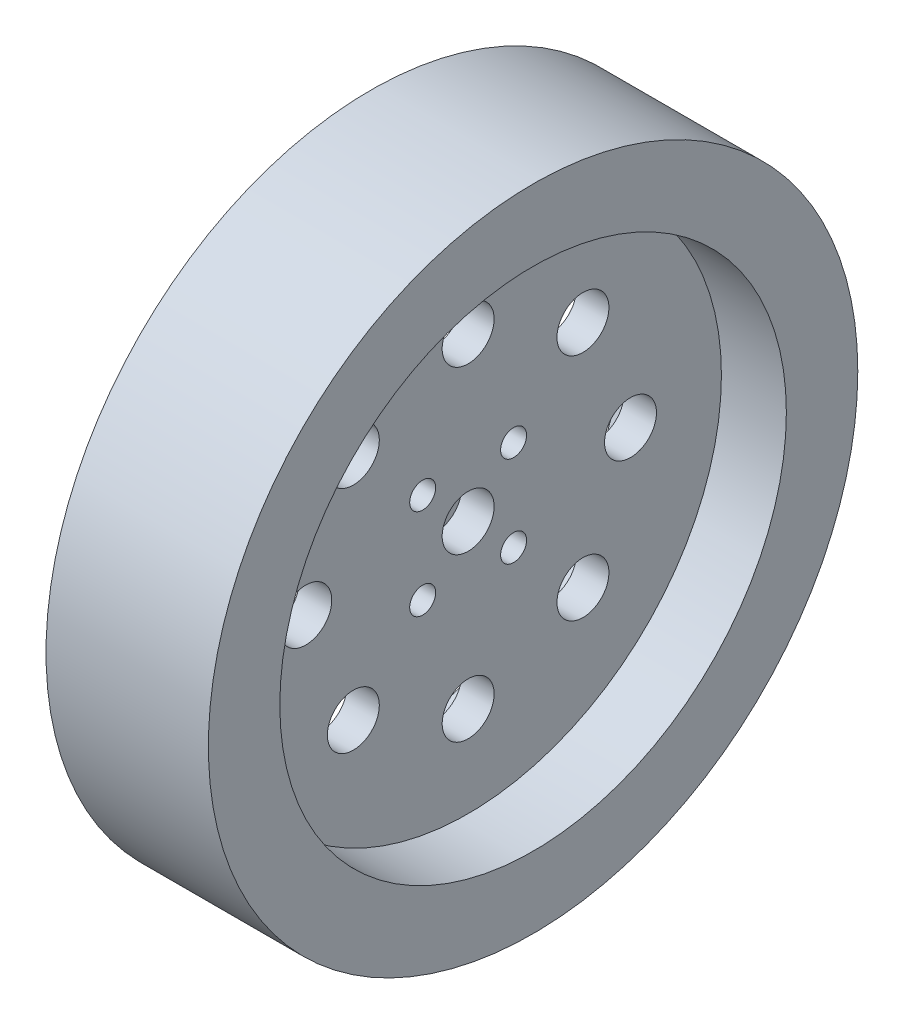
ISO-10303-21;
HEADER;
FILE_DESCRIPTION(('STEP AP214'),'2;1');
FILE_NAME('part.step','',(''),(''),'','','');
FILE_SCHEMA(('AUTOMOTIVE_DESIGN { 1 0 10303 214 1 1 1 1 }'));
ENDSEC;
DATA;
#1=APPLICATION_CONTEXT('core data for automotive mechanical design processes');
#2=APPLICATION_PROTOCOL_DEFINITION('international standard','automotive_design',2000,#1);
#3=PRODUCT_CONTEXT('',#1,'mechanical');
#4=PRODUCT('Part','Part','',(#3));
#5=PRODUCT_RELATED_PRODUCT_CATEGORY('part','',(#4));
#6=PRODUCT_DEFINITION_FORMATION('','',#4);
#7=PRODUCT_DEFINITION_CONTEXT('part definition',#1,'design');
#8=PRODUCT_DEFINITION('design','',#6,#7);
#9=PRODUCT_DEFINITION_SHAPE('','',#8);
#10=(LENGTH_UNIT() NAMED_UNIT(*) SI_UNIT(.MILLI.,.METRE.));
#11=(NAMED_UNIT(*) PLANE_ANGLE_UNIT() SI_UNIT($,.RADIAN.));
#12=(NAMED_UNIT(*) SI_UNIT($,.STERADIAN.) SOLID_ANGLE_UNIT());
#13=UNCERTAINTY_MEASURE_WITH_UNIT(LENGTH_MEASURE(1.E-05),#10,'distance_accuracy_value','');
#14=(GEOMETRIC_REPRESENTATION_CONTEXT(3) GLOBAL_UNCERTAINTY_ASSIGNED_CONTEXT((#13)) GLOBAL_UNIT_ASSIGNED_CONTEXT((#10,
#11,#12)) REPRESENTATION_CONTEXT('',''));
#15=CARTESIAN_POINT('',(0.,0.,0.));
#16=DIRECTION('',(0.,0.,1.));
#17=DIRECTION('',(1.,0.,0.));
#18=AXIS2_PLACEMENT_3D('',#15,#16,#17);
#19=CARTESIAN_POINT('',(12.5,0.,0.));
#20=DIRECTION('',(-1.,0.,0.));
#21=DIRECTION('',(0.,0.,1.));
#22=AXIS2_PLACEMENT_3D('',#19,#20,#21);
#23=CYLINDRICAL_SURFACE('',#22,50.);
#24=CARTESIAN_POINT('',(12.5,0.,0.));
#25=DIRECTION('',(1.,0.,0.));
#26=DIRECTION('',(0.,0.,-1.));
#27=AXIS2_PLACEMENT_3D('',#24,#25,#26);
#28=CIRCLE('',#27,50.);
#29=CARTESIAN_POINT('',(12.5,0.,-50.));
#30=VERTEX_POINT('',#29);
#31=EDGE_CURVE('E10',#30,#30,#28,.T.);
#32=ORIENTED_EDGE('',*,*,#31,.F.);
#33=EDGE_LOOP('',(#32));
#34=FACE_BOUND('',#33,.T.);
#35=CARTESIAN_POINT('',(-12.5,0.,0.));
#36=DIRECTION('',(1.,0.,0.));
#37=DIRECTION('',(0.,0.,-1.));
#38=AXIS2_PLACEMENT_3D('',#35,#36,#37);
#39=CIRCLE('',#38,50.);
#40=CARTESIAN_POINT('',(-12.5,0.,-50.));
#41=VERTEX_POINT('',#40);
#42=EDGE_CURVE('E83',#41,#41,#39,.T.);
#43=ORIENTED_EDGE('',*,*,#42,.T.);
#44=EDGE_LOOP('',(#43));
#45=FACE_BOUND('',#44,.T.);
#46=ADVANCED_FACE('F30',(#34,#45),#23,.T.);
#47=CARTESIAN_POINT('',(12.5,0.,0.));
#48=DIRECTION('',(1.,0.,0.));
#49=DIRECTION('',(0.,0.,-1.));
#50=AXIS2_PLACEMENT_3D('',#47,#48,#49);
#51=PLANE('',#50);
#52=CARTESIAN_POINT('',(12.5,0.,0.));
#53=DIRECTION('',(1.,0.,0.));
#54=DIRECTION('',(0.,0.,-1.));
#55=AXIS2_PLACEMENT_3D('',#52,#53,#54);
#56=CIRCLE('',#55,39.);
#57=CARTESIAN_POINT('',(12.5,0.,-39.));
#58=VERTEX_POINT('',#57);
#59=EDGE_CURVE('E40',#58,#58,#56,.T.);
#60=ORIENTED_EDGE('',*,*,#59,.F.);
#61=EDGE_LOOP('',(#60));
#62=FACE_BOUND('',#61,.T.);
#63=ORIENTED_EDGE('',*,*,#31,.T.);
#64=EDGE_LOOP('',(#63));
#65=FACE_BOUND('',#64,.T.);
#66=ADVANCED_FACE('F185',(#62,#65),#51,.T.);
#67=CARTESIAN_POINT('',(2.5,0.,0.));
#68=DIRECTION('',(1.,0.,0.));
#69=DIRECTION('',(0.,0.,-1.));
#70=AXIS2_PLACEMENT_3D('',#67,#68,#69);
#71=CYLINDRICAL_SURFACE('',#70,39.);
#72=CARTESIAN_POINT('',(2.5,0.,0.));
#73=DIRECTION('',(1.,0.,0.));
#74=DIRECTION('',(0.,0.,-1.));
#75=AXIS2_PLACEMENT_3D('',#72,#73,#74);
#76=CIRCLE('',#75,39.);
#77=CARTESIAN_POINT('',(2.5,0.,-39.));
#78=VERTEX_POINT('',#77);
#79=EDGE_CURVE('E36',#78,#78,#76,.T.);
#80=ORIENTED_EDGE('',*,*,#79,.F.);
#81=EDGE_LOOP('',(#80));
#82=FACE_BOUND('',#81,.T.);
#83=ORIENTED_EDGE('',*,*,#59,.T.);
#84=EDGE_LOOP('',(#83));
#85=FACE_BOUND('',#84,.T.);
#86=ADVANCED_FACE('F190',(#82,#85),#71,.F.);
#87=CARTESIAN_POINT('',(2.5,0.,0.));
#88=DIRECTION('',(1.,0.,0.));
#89=DIRECTION('',(0.,0.,-1.));
#90=AXIS2_PLACEMENT_3D('',#87,#88,#89);
#91=PLANE('',#90);
#92=CARTESIAN_POINT('',(2.5,-7.,-7.));
#93=DIRECTION('',(1.,0.,0.));
#94=DIRECTION('',(0.,0.,1.));
#95=AXIS2_PLACEMENT_3D('',#92,#93,#94);
#96=CIRCLE('',#95,2.);
#97=CARTESIAN_POINT('',(2.5,-7.,-5.));
#98=VERTEX_POINT('',#97);
#99=EDGE_CURVE('E79',#98,#98,#96,.T.);
#100=ORIENTED_EDGE('',*,*,#99,.F.);
#101=EDGE_LOOP('',(#100));
#102=FACE_BOUND('',#101,.T.);
#103=CARTESIAN_POINT('',(2.5,7.00000000000007,-6.99999999999993));
#104=DIRECTION('',(1.,0.,0.));
#105=DIRECTION('',(0.,-1.,0.));
#106=AXIS2_PLACEMENT_3D('',#103,#104,#105);
#107=CIRCLE('',#106,2.);
#108=CARTESIAN_POINT('',(2.5,5.00000000000007,-6.99999999999995));
#109=VERTEX_POINT('',#108);
#110=EDGE_CURVE('E80',#109,#109,#107,.T.);
#111=ORIENTED_EDGE('',*,*,#110,.F.);
#112=EDGE_LOOP('',(#111));
#113=FACE_BOUND('',#112,.T.);
#114=CARTESIAN_POINT('',(2.5,-7.00000000000002,6.99999999999998));
#115=DIRECTION('',(1.,0.,0.));
#116=DIRECTION('',(0.,1.,0.));
#117=AXIS2_PLACEMENT_3D('',#114,#115,#116);
#118=CIRCLE('',#117,2.);
#119=CARTESIAN_POINT('',(2.5,-5.00000000000002,6.99999999999998));
#120=VERTEX_POINT('',#119);
#121=EDGE_CURVE('E76',#120,#120,#118,.T.);
#122=ORIENTED_EDGE('',*,*,#121,.F.);
#123=EDGE_LOOP('',(#122));
#124=FACE_BOUND('',#123,.T.);
#125=CARTESIAN_POINT('',(2.5,7.,7.));
#126=DIRECTION('',(1.,0.,0.));
#127=DIRECTION('',(0.,0.,-1.));
#128=AXIS2_PLACEMENT_3D('',#125,#126,#127);
#129=CIRCLE('',#128,2.);
#130=CARTESIAN_POINT('',(2.5,7.,5.));
#131=VERTEX_POINT('',#130);
#132=EDGE_CURVE('E73',#131,#131,#129,.T.);
#133=ORIENTED_EDGE('',*,*,#132,.F.);
#134=EDGE_LOOP('',(#133));
#135=FACE_BOUND('',#134,.T.);
#136=CARTESIAN_POINT('',(2.5,0.,0.));
#137=DIRECTION('',(1.,0.,0.));
#138=DIRECTION('',(0.,0.,-1.));
#139=AXIS2_PLACEMENT_3D('',#136,#137,#138);
#140=CIRCLE('',#139,4.);
#141=CARTESIAN_POINT('',(2.5,0.,-4.));
#142=VERTEX_POINT('',#141);
#143=EDGE_CURVE('E57',#142,#142,#140,.T.);
#144=ORIENTED_EDGE('',*,*,#143,.F.);
#145=EDGE_LOOP('',(#144));
#146=FACE_BOUND('',#145,.T.);
#147=CARTESIAN_POINT('',(2.5,0.,25.));
#148=DIRECTION('',(1.,0.,0.));
#149=DIRECTION('',(0.,1.,0.));
#150=AXIS2_PLACEMENT_3D('',#147,#148,#149);
#151=CIRCLE('',#150,4.);
#152=CARTESIAN_POINT('',(2.5,3.99999999999991,25.));
#153=VERTEX_POINT('',#152);
#154=EDGE_CURVE('E52',#153,#153,#151,.T.);
#155=ORIENTED_EDGE('',*,*,#154,.F.);
#156=EDGE_LOOP('',(#155));
#157=FACE_BOUND('',#156,.T.);
#158=CARTESIAN_POINT('',(2.5,-17.6776695296638,17.6776695296636));
#159=DIRECTION('',(1.,0.,0.));
#160=DIRECTION('',(0.,0.707106781186544,0.707106781186551));
#161=AXIS2_PLACEMENT_3D('',#158,#159,#160);
#162=CIRCLE('',#161,4.);
#163=CARTESIAN_POINT('',(2.5,-14.8492424049176,20.5060966544098));
#164=VERTEX_POINT('',#163);
#165=EDGE_CURVE('E66',#164,#164,#162,.T.);
#166=ORIENTED_EDGE('',*,*,#165,.F.);
#167=EDGE_LOOP('',(#166));
#168=FACE_BOUND('',#167,.T.);
#169=CARTESIAN_POINT('',(2.5,-25.,0.));
#170=DIRECTION('',(1.,0.,0.));
#171=DIRECTION('',(0.,0.,1.));
#172=AXIS2_PLACEMENT_3D('',#169,#170,#171);
#173=CIRCLE('',#172,4.);
#174=CARTESIAN_POINT('',(2.5,-25.,4.));
#175=VERTEX_POINT('',#174);
#176=EDGE_CURVE('E63',#175,#175,#173,.T.);
#177=ORIENTED_EDGE('',*,*,#176,.F.);
#178=EDGE_LOOP('',(#177));
#179=FACE_BOUND('',#178,.T.);
#180=CARTESIAN_POINT('',(2.5,-17.6776695296635,-17.6776695296638));
#181=DIRECTION('',(1.,0.,0.));
#182=DIRECTION('',(0.,-0.707106781186554,0.707106781186541));
#183=AXIS2_PLACEMENT_3D('',#180,#181,#182);
#184=CIRCLE('',#183,4.);
#185=CARTESIAN_POINT('',(2.5,-20.5060966544097,-14.8492424049177));
#186=VERTEX_POINT('',#185);
#187=EDGE_CURVE('E60',#186,#186,#184,.T.);
#188=ORIENTED_EDGE('',*,*,#187,.F.);
#189=EDGE_LOOP('',(#188));
#190=FACE_BOUND('',#189,.T.);
#191=CARTESIAN_POINT('',(2.5,2.61861100413235E-13,-25.));
#192=DIRECTION('',(1.,0.,0.));
#193=DIRECTION('',(0.,-1.,0.));
#194=AXIS2_PLACEMENT_3D('',#191,#192,#193);
#195=CIRCLE('',#194,4.);
#196=CARTESIAN_POINT('',(2.5,-3.99999999999974,-25.));
#197=VERTEX_POINT('',#196);
#198=EDGE_CURVE('E56',#197,#197,#195,.T.);
#199=ORIENTED_EDGE('',*,*,#198,.F.);
#200=EDGE_LOOP('',(#199));
#201=FACE_BOUND('',#200,.T.);
#202=CARTESIAN_POINT('',(2.5,17.6776695296639,-17.6776695296635));
#203=DIRECTION('',(1.,0.,0.));
#204=DIRECTION('',(0.,-0.707106781186539,-0.707106781186556));
#205=AXIS2_PLACEMENT_3D('',#202,#203,#204);
#206=CIRCLE('',#205,4.);
#207=CARTESIAN_POINT('',(2.5,14.8492424049177,-20.5060966544097));
#208=VERTEX_POINT('',#207);
#209=EDGE_CURVE('E53',#208,#208,#206,.T.);
#210=ORIENTED_EDGE('',*,*,#209,.F.);
#211=EDGE_LOOP('',(#210));
#212=FACE_BOUND('',#211,.T.);
#213=CARTESIAN_POINT('',(2.5,17.6776695296637,17.6776695296637));
#214=DIRECTION('',(1.,0.,0.));
#215=DIRECTION('',(0.,0.707106781186549,-0.707106781186546));
#216=AXIS2_PLACEMENT_3D('',#213,#214,#215);
#217=CIRCLE('',#216,4.);
#218=CARTESIAN_POINT('',(2.5,20.5060966544099,14.8492424049175));
#219=VERTEX_POINT('',#218);
#220=EDGE_CURVE('E49',#219,#219,#217,.T.);
#221=ORIENTED_EDGE('',*,*,#220,.F.);
#222=EDGE_LOOP('',(#221));
#223=FACE_BOUND('',#222,.T.);
#224=CARTESIAN_POINT('',(2.5,25.,0.));
#225=DIRECTION('',(1.,0.,0.));
#226=DIRECTION('',(0.,0.,-1.));
#227=AXIS2_PLACEMENT_3D('',#224,#225,#226);
#228=CIRCLE('',#227,4.);
#229=CARTESIAN_POINT('',(2.5,25.,-4.));
#230=VERTEX_POINT('',#229);
#231=EDGE_CURVE('E45',#230,#230,#228,.T.);
#232=ORIENTED_EDGE('',*,*,#231,.F.);
#233=EDGE_LOOP('',(#232));
#234=FACE_BOUND('',#233,.T.);
#235=ORIENTED_EDGE('',*,*,#79,.T.);
#236=EDGE_LOOP('',(#235));
#237=FACE_BOUND('',#236,.T.);
#238=ADVANCED_FACE('F195',(#102,#113,#124,#135,#146,#157,#168,#179,#190,#201,#212,#223,#234,
#237),#91,.T.);
#239=CARTESIAN_POINT('',(0.,25.,0.));
#240=DIRECTION('',(1.,0.,0.));
#241=DIRECTION('',(0.,0.,-1.));
#242=AXIS2_PLACEMENT_3D('',#239,#240,#241);
#243=CYLINDRICAL_SURFACE('',#242,4.);
#244=ORIENTED_EDGE('',*,*,#231,.T.);
#245=EDGE_LOOP('',(#244));
#246=FACE_BOUND('',#245,.T.);
#247=CARTESIAN_POINT('',(-2.5,25.,0.));
#248=DIRECTION('',(1.,0.,0.));
#249=DIRECTION('',(0.,0.,-1.));
#250=AXIS2_PLACEMENT_3D('',#247,#248,#249);
#251=CIRCLE('',#250,4.);
#252=CARTESIAN_POINT('',(-2.5,25.,-4.));
#253=VERTEX_POINT('',#252);
#254=EDGE_CURVE('E92',#253,#253,#251,.T.);
#255=ORIENTED_EDGE('',*,*,#254,.F.);
#256=EDGE_LOOP('',(#255));
#257=FACE_BOUND('',#256,.T.);
#258=ADVANCED_FACE('F202',(#246,#257),#243,.F.);
#259=CARTESIAN_POINT('',(0.,17.6776695296637,17.6776695296637));
#260=DIRECTION('',(1.,0.,0.));
#261=DIRECTION('',(0.,0.,-1.));
#262=AXIS2_PLACEMENT_3D('',#259,#260,#261);
#263=CYLINDRICAL_SURFACE('',#262,4.);
#264=ORIENTED_EDGE('',*,*,#220,.T.);
#265=EDGE_LOOP('',(#264));
#266=FACE_BOUND('',#265,.T.);
#267=CARTESIAN_POINT('',(-2.5,17.6776695296637,17.6776695296637));
#268=DIRECTION('',(1.,0.,0.));
#269=DIRECTION('',(0.,0.707106781186549,-0.707106781186546));
#270=AXIS2_PLACEMENT_3D('',#267,#268,#269);
#271=CIRCLE('',#270,4.);
#272=CARTESIAN_POINT('',(-2.5,20.5060966544099,14.8492424049175));
#273=VERTEX_POINT('',#272);
#274=EDGE_CURVE('E97',#273,#273,#271,.T.);
#275=ORIENTED_EDGE('',*,*,#274,.F.);
#276=EDGE_LOOP('',(#275));
#277=FACE_BOUND('',#276,.T.);
#278=ADVANCED_FACE('F206',(#266,#277),#263,.F.);
#279=CARTESIAN_POINT('',(0.,17.6776695296639,-17.6776695296635));
#280=DIRECTION('',(1.,0.,0.));
#281=DIRECTION('',(0.,0.,-1.));
#282=AXIS2_PLACEMENT_3D('',#279,#280,#281);
#283=CYLINDRICAL_SURFACE('',#282,4.);
#284=ORIENTED_EDGE('',*,*,#209,.T.);
#285=EDGE_LOOP('',(#284));
#286=FACE_BOUND('',#285,.T.);
#287=CARTESIAN_POINT('',(-2.5,17.6776695296639,-17.6776695296635));
#288=DIRECTION('',(1.,0.,0.));
#289=DIRECTION('',(0.,-0.707106781186539,-0.707106781186556));
#290=AXIS2_PLACEMENT_3D('',#287,#288,#289);
#291=CIRCLE('',#290,4.);
#292=CARTESIAN_POINT('',(-2.5,14.8492424049177,-20.5060966544097));
#293=VERTEX_POINT('',#292);
#294=EDGE_CURVE('E98',#293,#293,#291,.T.);
#295=ORIENTED_EDGE('',*,*,#294,.F.);
#296=EDGE_LOOP('',(#295));
#297=FACE_BOUND('',#296,.T.);
#298=ADVANCED_FACE('F210',(#286,#297),#283,.F.);
#299=CARTESIAN_POINT('',(0.,2.61861100413235E-13,-25.));
#300=DIRECTION('',(1.,0.,0.));
#301=DIRECTION('',(0.,0.,-1.));
#302=AXIS2_PLACEMENT_3D('',#299,#300,#301);
#303=CYLINDRICAL_SURFACE('',#302,4.);
#304=ORIENTED_EDGE('',*,*,#198,.T.);
#305=EDGE_LOOP('',(#304));
#306=FACE_BOUND('',#305,.T.);
#307=CARTESIAN_POINT('',(-2.5,2.61861100413235E-13,-25.));
#308=DIRECTION('',(1.,0.,0.));
#309=DIRECTION('',(0.,-1.,0.));
#310=AXIS2_PLACEMENT_3D('',#307,#308,#309);
#311=CIRCLE('',#310,4.);
#312=CARTESIAN_POINT('',(-2.5,-3.99999999999974,-25.));
#313=VERTEX_POINT('',#312);
#314=EDGE_CURVE('E101',#313,#313,#311,.T.);
#315=ORIENTED_EDGE('',*,*,#314,.F.);
#316=EDGE_LOOP('',(#315));
#317=FACE_BOUND('',#316,.T.);
#318=ADVANCED_FACE('F214',(#306,#317),#303,.F.);
#319=CARTESIAN_POINT('',(0.,-17.6776695296635,-17.6776695296638));
#320=DIRECTION('',(1.,0.,0.));
#321=DIRECTION('',(0.,0.,-1.));
#322=AXIS2_PLACEMENT_3D('',#319,#320,#321);
#323=CYLINDRICAL_SURFACE('',#322,4.);
#324=ORIENTED_EDGE('',*,*,#187,.T.);
#325=EDGE_LOOP('',(#324));
#326=FACE_BOUND('',#325,.T.);
#327=CARTESIAN_POINT('',(-2.5,-17.6776695296635,-17.6776695296638));
#328=DIRECTION('',(1.,0.,0.));
#329=DIRECTION('',(0.,-0.707106781186554,0.707106781186541));
#330=AXIS2_PLACEMENT_3D('',#327,#328,#329);
#331=CIRCLE('',#330,4.);
#332=CARTESIAN_POINT('',(-2.5,-20.5060966544097,-14.8492424049177));
#333=VERTEX_POINT('',#332);
#334=EDGE_CURVE('E105',#333,#333,#331,.T.);
#335=ORIENTED_EDGE('',*,*,#334,.F.);
#336=EDGE_LOOP('',(#335));
#337=FACE_BOUND('',#336,.T.);
#338=ADVANCED_FACE('F218',(#326,#337),#323,.F.);
#339=CARTESIAN_POINT('',(0.,-25.,0.));
#340=DIRECTION('',(1.,0.,0.));
#341=DIRECTION('',(0.,0.,-1.));
#342=AXIS2_PLACEMENT_3D('',#339,#340,#341);
#343=CYLINDRICAL_SURFACE('',#342,4.);
#344=ORIENTED_EDGE('',*,*,#176,.T.);
#345=EDGE_LOOP('',(#344));
#346=FACE_BOUND('',#345,.T.);
#347=CARTESIAN_POINT('',(-2.5,-25.,0.));
#348=DIRECTION('',(1.,0.,0.));
#349=DIRECTION('',(0.,0.,1.));
#350=AXIS2_PLACEMENT_3D('',#347,#348,#349);
#351=CIRCLE('',#350,4.);
#352=CARTESIAN_POINT('',(-2.5,-25.,4.));
#353=VERTEX_POINT('',#352);
#354=EDGE_CURVE('E108',#353,#353,#351,.T.);
#355=ORIENTED_EDGE('',*,*,#354,.F.);
#356=EDGE_LOOP('',(#355));
#357=FACE_BOUND('',#356,.T.);
#358=ADVANCED_FACE('F222',(#346,#357),#343,.F.);
#359=CARTESIAN_POINT('',(0.,-17.6776695296638,17.6776695296636));
#360=DIRECTION('',(1.,0.,0.));
#361=DIRECTION('',(0.,0.,-1.));
#362=AXIS2_PLACEMENT_3D('',#359,#360,#361);
#363=CYLINDRICAL_SURFACE('',#362,4.);
#364=ORIENTED_EDGE('',*,*,#165,.T.);
#365=EDGE_LOOP('',(#364));
#366=FACE_BOUND('',#365,.T.);
#367=CARTESIAN_POINT('',(-2.5,-17.6776695296638,17.6776695296636));
#368=DIRECTION('',(1.,0.,0.));
#369=DIRECTION('',(0.,0.707106781186544,0.707106781186551));
#370=AXIS2_PLACEMENT_3D('',#367,#368,#369);
#371=CIRCLE('',#370,4.);
#372=CARTESIAN_POINT('',(-2.5,-14.8492424049176,20.5060966544098));
#373=VERTEX_POINT('',#372);
#374=EDGE_CURVE('E111',#373,#373,#371,.T.);
#375=ORIENTED_EDGE('',*,*,#374,.F.);
#376=EDGE_LOOP('',(#375));
#377=FACE_BOUND('',#376,.T.);
#378=ADVANCED_FACE('F226',(#366,#377),#363,.F.);
#379=CARTESIAN_POINT('',(0.,0.,25.));
#380=DIRECTION('',(1.,0.,0.));
#381=DIRECTION('',(0.,0.,-1.));
#382=AXIS2_PLACEMENT_3D('',#379,#380,#381);
#383=CYLINDRICAL_SURFACE('',#382,4.);
#384=ORIENTED_EDGE('',*,*,#154,.T.);
#385=EDGE_LOOP('',(#384));
#386=FACE_BOUND('',#385,.T.);
#387=CARTESIAN_POINT('',(-2.5,0.,25.));
#388=DIRECTION('',(1.,0.,0.));
#389=DIRECTION('',(0.,1.,0.));
#390=AXIS2_PLACEMENT_3D('',#387,#388,#389);
#391=CIRCLE('',#390,4.);
#392=CARTESIAN_POINT('',(-2.5,3.99999999999991,25.));
#393=VERTEX_POINT('',#392);
#394=EDGE_CURVE('E114',#393,#393,#391,.T.);
#395=ORIENTED_EDGE('',*,*,#394,.F.);
#396=EDGE_LOOP('',(#395));
#397=FACE_BOUND('',#396,.T.);
#398=ADVANCED_FACE('F230',(#386,#397),#383,.F.);
#399=CARTESIAN_POINT('',(0.,0.,0.));
#400=DIRECTION('',(1.,0.,0.));
#401=DIRECTION('',(0.,0.,-1.));
#402=AXIS2_PLACEMENT_3D('',#399,#400,#401);
#403=CYLINDRICAL_SURFACE('',#402,4.);
#404=ORIENTED_EDGE('',*,*,#143,.T.);
#405=EDGE_LOOP('',(#404));
#406=FACE_BOUND('',#405,.T.);
#407=CARTESIAN_POINT('',(-2.5,0.,0.));
#408=DIRECTION('',(1.,0.,0.));
#409=DIRECTION('',(0.,0.,-1.));
#410=AXIS2_PLACEMENT_3D('',#407,#408,#409);
#411=CIRCLE('',#410,4.);
#412=CARTESIAN_POINT('',(-2.5,0.,-4.));
#413=VERTEX_POINT('',#412);
#414=EDGE_CURVE('E102',#413,#413,#411,.T.);
#415=ORIENTED_EDGE('',*,*,#414,.F.);
#416=EDGE_LOOP('',(#415));
#417=FACE_BOUND('',#416,.T.);
#418=ADVANCED_FACE('F234',(#406,#417),#403,.F.);
#419=CARTESIAN_POINT('',(0.,7.,7.));
#420=DIRECTION('',(1.,0.,0.));
#421=DIRECTION('',(0.,0.,-1.));
#422=AXIS2_PLACEMENT_3D('',#419,#420,#421);
#423=CYLINDRICAL_SURFACE('',#422,2.);
#424=ORIENTED_EDGE('',*,*,#132,.T.);
#425=EDGE_LOOP('',(#424));
#426=FACE_BOUND('',#425,.T.);
#427=CARTESIAN_POINT('',(-2.5,7.,7.));
#428=DIRECTION('',(1.,0.,0.));
#429=DIRECTION('',(0.,0.,-1.));
#430=AXIS2_PLACEMENT_3D('',#427,#428,#429);
#431=CIRCLE('',#430,2.);
#432=CARTESIAN_POINT('',(-2.5,7.,5.));
#433=VERTEX_POINT('',#432);
#434=EDGE_CURVE('E121',#433,#433,#431,.T.);
#435=ORIENTED_EDGE('',*,*,#434,.F.);
#436=EDGE_LOOP('',(#435));
#437=FACE_BOUND('',#436,.T.);
#438=ADVANCED_FACE('F238',(#426,#437),#423,.F.);
#439=CARTESIAN_POINT('',(0.,-7.00000000000002,6.99999999999998));
#440=DIRECTION('',(1.,0.,0.));
#441=DIRECTION('',(0.,0.,-1.));
#442=AXIS2_PLACEMENT_3D('',#439,#440,#441);
#443=CYLINDRICAL_SURFACE('',#442,2.);
#444=ORIENTED_EDGE('',*,*,#121,.T.);
#445=EDGE_LOOP('',(#444));
#446=FACE_BOUND('',#445,.T.);
#447=CARTESIAN_POINT('',(-2.5,-7.00000000000002,6.99999999999998));
#448=DIRECTION('',(1.,0.,0.));
#449=DIRECTION('',(0.,1.,0.));
#450=AXIS2_PLACEMENT_3D('',#447,#448,#449);
#451=CIRCLE('',#450,2.);
#452=CARTESIAN_POINT('',(-2.5,-5.00000000000002,6.99999999999998));
#453=VERTEX_POINT('',#452);
#454=EDGE_CURVE('E124',#453,#453,#451,.T.);
#455=ORIENTED_EDGE('',*,*,#454,.F.);
#456=EDGE_LOOP('',(#455));
#457=FACE_BOUND('',#456,.T.);
#458=ADVANCED_FACE('F242',(#446,#457),#443,.F.);
#459=CARTESIAN_POINT('',(0.,7.00000000000007,-6.99999999999993));
#460=DIRECTION('',(1.,0.,0.));
#461=DIRECTION('',(0.,0.,-1.));
#462=AXIS2_PLACEMENT_3D('',#459,#460,#461);
#463=CYLINDRICAL_SURFACE('',#462,2.);
#464=ORIENTED_EDGE('',*,*,#110,.T.);
#465=EDGE_LOOP('',(#464));
#466=FACE_BOUND('',#465,.T.);
#467=CARTESIAN_POINT('',(-2.5,7.00000000000007,-6.99999999999993));
#468=DIRECTION('',(1.,0.,0.));
#469=DIRECTION('',(0.,-1.,0.));
#470=AXIS2_PLACEMENT_3D('',#467,#468,#469);
#471=CIRCLE('',#470,2.);
#472=CARTESIAN_POINT('',(-2.5,5.00000000000007,-6.99999999999995));
#473=VERTEX_POINT('',#472);
#474=EDGE_CURVE('E125',#473,#473,#471,.T.);
#475=ORIENTED_EDGE('',*,*,#474,.F.);
#476=EDGE_LOOP('',(#475));
#477=FACE_BOUND('',#476,.T.);
#478=ADVANCED_FACE('F246',(#466,#477),#463,.F.);
#479=CARTESIAN_POINT('',(0.,-7.,-7.));
#480=DIRECTION('',(1.,0.,0.));
#481=DIRECTION('',(0.,0.,-1.));
#482=AXIS2_PLACEMENT_3D('',#479,#480,#481);
#483=CYLINDRICAL_SURFACE('',#482,2.);
#484=ORIENTED_EDGE('',*,*,#99,.T.);
#485=EDGE_LOOP('',(#484));
#486=FACE_BOUND('',#485,.T.);
#487=CARTESIAN_POINT('',(-2.5,-7.,-7.));
#488=DIRECTION('',(1.,0.,0.));
#489=DIRECTION('',(0.,0.,1.));
#490=AXIS2_PLACEMENT_3D('',#487,#488,#489);
#491=CIRCLE('',#490,2.);
#492=CARTESIAN_POINT('',(-2.5,-7.,-5.));
#493=VERTEX_POINT('',#492);
#494=EDGE_CURVE('E128',#493,#493,#491,.T.);
#495=ORIENTED_EDGE('',*,*,#494,.F.);
#496=EDGE_LOOP('',(#495));
#497=FACE_BOUND('',#496,.T.);
#498=ADVANCED_FACE('F180',(#486,#497),#483,.F.);
#499=CARTESIAN_POINT('',(-12.5,0.,0.));
#500=DIRECTION('',(-1.,0.,0.));
#501=DIRECTION('',(0.,0.,-1.));
#502=AXIS2_PLACEMENT_3D('',#499,#500,#501);
#503=PLANE('',#502);
#504=CARTESIAN_POINT('',(-12.5,0.,0.));
#505=DIRECTION('',(1.,0.,0.));
#506=DIRECTION('',(0.,0.,-1.));
#507=AXIS2_PLACEMENT_3D('',#504,#505,#506);
#508=CIRCLE('',#507,39.);
#509=CARTESIAN_POINT('',(-12.5,0.,-39.));
#510=VERTEX_POINT('',#509);
#511=EDGE_CURVE('E89',#510,#510,#508,.T.);
#512=ORIENTED_EDGE('',*,*,#511,.T.);
#513=EDGE_LOOP('',(#512));
#514=FACE_BOUND('',#513,.T.);
#515=ORIENTED_EDGE('',*,*,#42,.F.);
#516=EDGE_LOOP('',(#515));
#517=FACE_BOUND('',#516,.T.);
#518=ADVANCED_FACE('F174',(#514,#517),#503,.T.);
#519=CARTESIAN_POINT('',(-2.5,0.,0.));
#520=DIRECTION('',(-1.,0.,0.));
#521=DIRECTION('',(0.,0.,1.));
#522=AXIS2_PLACEMENT_3D('',#519,#520,#521);
#523=CYLINDRICAL_SURFACE('',#522,39.);
#524=CARTESIAN_POINT('',(-2.5,0.,0.));
#525=DIRECTION('',(1.,0.,0.));
#526=DIRECTION('',(0.,0.,-1.));
#527=AXIS2_PLACEMENT_3D('',#524,#525,#526);
#528=CIRCLE('',#527,39.);
#529=CARTESIAN_POINT('',(-2.5,0.,-39.));
#530=VERTEX_POINT('',#529);
#531=EDGE_CURVE('E88',#530,#530,#528,.T.);
#532=ORIENTED_EDGE('',*,*,#531,.T.);
#533=EDGE_LOOP('',(#532));
#534=FACE_BOUND('',#533,.T.);
#535=ORIENTED_EDGE('',*,*,#511,.F.);
#536=EDGE_LOOP('',(#535));
#537=FACE_BOUND('',#536,.T.);
#538=ADVANCED_FACE('F152',(#534,#537),#523,.F.);
#539=CARTESIAN_POINT('',(-2.5,0.,0.));
#540=DIRECTION('',(-1.,0.,0.));
#541=DIRECTION('',(0.,0.,-1.));
#542=AXIS2_PLACEMENT_3D('',#539,#540,#541);
#543=PLANE('',#542);
#544=CARTESIAN_POINT('',(-2.5,0.,0.));
#545=DIRECTION('',(-1.,0.,0.));
#546=DIRECTION('',(0.,0.,1.));
#547=AXIS2_PLACEMENT_3D('',#544,#545,#546);
#548=CIRCLE('',#547,12.5);
#549=CARTESIAN_POINT('',(-2.5,0.,12.5));
#550=VERTEX_POINT('',#549);
#551=EDGE_CURVE('E134',#550,#550,#548,.T.);
#552=ORIENTED_EDGE('',*,*,#551,.F.);
#553=EDGE_LOOP('',(#552));
#554=FACE_BOUND('',#553,.T.);
#555=ORIENTED_EDGE('',*,*,#274,.T.);
#556=EDGE_LOOP('',(#555));
#557=FACE_BOUND('',#556,.T.);
#558=ORIENTED_EDGE('',*,*,#394,.T.);
#559=EDGE_LOOP('',(#558));
#560=FACE_BOUND('',#559,.T.);
#561=ORIENTED_EDGE('',*,*,#374,.T.);
#562=EDGE_LOOP('',(#561));
#563=FACE_BOUND('',#562,.T.);
#564=ORIENTED_EDGE('',*,*,#354,.T.);
#565=EDGE_LOOP('',(#564));
#566=FACE_BOUND('',#565,.T.);
#567=ORIENTED_EDGE('',*,*,#334,.T.);
#568=EDGE_LOOP('',(#567));
#569=FACE_BOUND('',#568,.T.);
#570=ORIENTED_EDGE('',*,*,#314,.T.);
#571=EDGE_LOOP('',(#570));
#572=FACE_BOUND('',#571,.T.);
#573=ORIENTED_EDGE('',*,*,#294,.T.);
#574=EDGE_LOOP('',(#573));
#575=FACE_BOUND('',#574,.T.);
#576=ORIENTED_EDGE('',*,*,#254,.T.);
#577=EDGE_LOOP('',(#576));
#578=FACE_BOUND('',#577,.T.);
#579=ORIENTED_EDGE('',*,*,#531,.F.);
#580=EDGE_LOOP('',(#579));
#581=FACE_BOUND('',#580,.T.);
#582=ADVANCED_FACE('F149',(#554,#557,#560,#563,#566,#569,#572,#575,#578,#581),#543,.T.);
#583=CARTESIAN_POINT('',(-10.5,0.,0.));
#584=DIRECTION('',(-1.,0.,0.));
#585=DIRECTION('',(0.,0.,1.));
#586=AXIS2_PLACEMENT_3D('',#583,#584,#585);
#587=PLANE('',#586);
#588=CARTESIAN_POINT('',(-10.5,0.,0.));
#589=DIRECTION('',(-1.,0.,0.));
#590=DIRECTION('',(0.,0.,1.));
#591=AXIS2_PLACEMENT_3D('',#588,#589,#590);
#592=CIRCLE('',#591,12.5);
#593=CARTESIAN_POINT('',(-10.5,0.,12.5));
#594=VERTEX_POINT('',#593);
#595=EDGE_CURVE('E129',#594,#594,#592,.T.);
#596=ORIENTED_EDGE('',*,*,#595,.T.);
#597=EDGE_LOOP('',(#596));
#598=FACE_BOUND('',#597,.T.);
#599=ADVANCED_FACE('F140',(#598),#587,.T.);
#600=CARTESIAN_POINT('',(-10.5,0.,0.));
#601=DIRECTION('',(1.,0.,0.));
#602=DIRECTION('',(0.,0.,-1.));
#603=AXIS2_PLACEMENT_3D('',#600,#601,#602);
#604=CYLINDRICAL_SURFACE('',#603,12.5);
#605=ORIENTED_EDGE('',*,*,#595,.F.);
#606=EDGE_LOOP('',(#605));
#607=FACE_BOUND('',#606,.T.);
#608=ORIENTED_EDGE('',*,*,#551,.T.);
#609=EDGE_LOOP('',(#608));
#610=FACE_BOUND('',#609,.T.);
#611=ADVANCED_FACE('F142',(#607,#610),#604,.T.);
#612=CARTESIAN_POINT('',(-2.5,0.,0.));
#613=DIRECTION('',(-1.,0.,0.));
#614=DIRECTION('',(0.,0.,1.));
#615=AXIS2_PLACEMENT_3D('',#612,#613,#614);
#616=PLANE('',#615);
#617=ORIENTED_EDGE('',*,*,#494,.T.);
#618=EDGE_LOOP('',(#617));
#619=FACE_BOUND('',#618,.T.);
#620=ADVANCED_FACE('F145',(#619),#616,.F.);
#621=ORIENTED_EDGE('',*,*,#474,.T.);
#622=EDGE_LOOP('',(#621));
#623=FACE_BOUND('',#622,.T.);
#624=ADVANCED_FACE('F274',(#623),#616,.F.);
#625=ORIENTED_EDGE('',*,*,#454,.T.);
#626=EDGE_LOOP('',(#625));
#627=FACE_BOUND('',#626,.T.);
#628=ADVANCED_FACE('F281',(#627),#616,.F.);
#629=ORIENTED_EDGE('',*,*,#434,.T.);
#630=EDGE_LOOP('',(#629));
#631=FACE_BOUND('',#630,.T.);
#632=ADVANCED_FACE('F257',(#631),#616,.F.);
#633=ORIENTED_EDGE('',*,*,#414,.T.);
#634=EDGE_LOOP('',(#633));
#635=FACE_BOUND('',#634,.T.);
#636=ADVANCED_FACE('F254',(#635),#616,.F.);
#637=CLOSED_SHELL('',(#46,#66,#86,#238,#258,#278,#298,#318,#338,#358,#378,#398,#418,#438,#458,
#478,#498,#518,#538,#582,#599,#611,#620,#624,#628,#632,#636));
#638=MANIFOLD_SOLID_BREP('B2',#637);
#639=ADVANCED_BREP_SHAPE_REPRESENTATION('',(#18,#638),#14);
#640=SHAPE_DEFINITION_REPRESENTATION(#9,#639);
ENDSEC;
END-ISO-10303-21;
